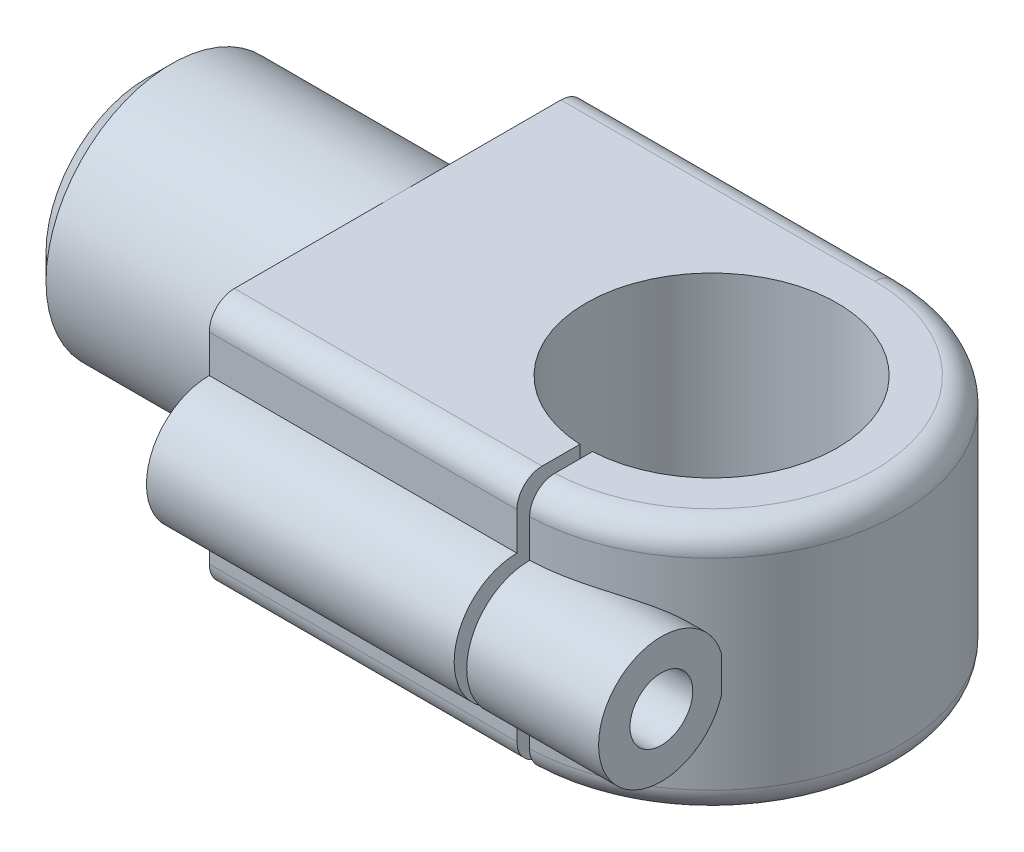
ISO-10303-21;
HEADER;
FILE_DESCRIPTION(('STEP AP214'),'2;1');
FILE_NAME('part.step','',(''),(''),'','','');
FILE_SCHEMA(('AUTOMOTIVE_DESIGN { 1 0 10303 214 1 1 1 1 }'));
ENDSEC;
DATA;
#1=APPLICATION_CONTEXT('core data for automotive mechanical design processes');
#2=APPLICATION_PROTOCOL_DEFINITION('international standard','automotive_design',2000,#1);
#3=PRODUCT_CONTEXT('',#1,'mechanical');
#4=PRODUCT('Part','Part','',(#3));
#5=PRODUCT_RELATED_PRODUCT_CATEGORY('part','',(#4));
#6=PRODUCT_DEFINITION_FORMATION('','',#4);
#7=PRODUCT_DEFINITION_CONTEXT('part definition',#1,'design');
#8=PRODUCT_DEFINITION('design','',#6,#7);
#9=PRODUCT_DEFINITION_SHAPE('','',#8);
#10=(LENGTH_UNIT() NAMED_UNIT(*) SI_UNIT(.MILLI.,.METRE.));
#11=(NAMED_UNIT(*) PLANE_ANGLE_UNIT() SI_UNIT($,.RADIAN.));
#12=(NAMED_UNIT(*) SI_UNIT($,.STERADIAN.) SOLID_ANGLE_UNIT());
#13=UNCERTAINTY_MEASURE_WITH_UNIT(LENGTH_MEASURE(1.E-05),#10,'distance_accuracy_value','');
#14=(GEOMETRIC_REPRESENTATION_CONTEXT(3) GLOBAL_UNCERTAINTY_ASSIGNED_CONTEXT((#13)) GLOBAL_UNIT_ASSIGNED_CONTEXT((#10,
#11,#12)) REPRESENTATION_CONTEXT('',''));
#15=CARTESIAN_POINT('',(0.,0.,0.));
#16=DIRECTION('',(0.,0.,1.));
#17=DIRECTION('',(1.,0.,0.));
#18=AXIS2_PLACEMENT_3D('',#15,#16,#17);
#19=CARTESIAN_POINT('',(-44.9999999999995,10.,-4.71844785465692E-13));
#20=DIRECTION('',(-1.,0.,0.));
#21=DIRECTION('',(0.,0.,1.));
#22=AXIS2_PLACEMENT_3D('',#19,#20,#21);
#23=PLANE('',#22);
#24=CARTESIAN_POINT('',(-44.9999999999996,10.,-4.71844785465692E-13));
#25=DIRECTION('',(1.,0.,0.));
#26=DIRECTION('',(0.,0.,-1.));
#27=AXIS2_PLACEMENT_3D('',#24,#25,#26);
#28=CIRCLE('',#27,8.00000000000017);
#29=CARTESIAN_POINT('',(-44.9999999999996,10.,-8.00000000000064));
#30=VERTEX_POINT('',#29);
#31=EDGE_CURVE('E20',#30,#30,#28,.T.);
#32=ORIENTED_EDGE('',*,*,#31,.F.);
#33=EDGE_LOOP('',(#32));
#34=FACE_BOUND('',#33,.T.);
#35=ADVANCED_FACE('F17',(#34),#23,.T.);
#36=CARTESIAN_POINT('',(-20.,10.,15.));
#37=DIRECTION('',(1.,0.,0.));
#38=DIRECTION('',(0.,0.,-1.));
#39=AXIS2_PLACEMENT_3D('',#36,#37,#38);
#40=PLANE('',#39);
#41=CARTESIAN_POINT('',(-20.,10.,15.));
#42=DIRECTION('',(1.,0.,0.));
#43=DIRECTION('',(0.,0.,-1.));
#44=AXIS2_PLACEMENT_3D('',#41,#42,#43);
#45=CIRCLE('',#44,2.5000000000001);
#46=CARTESIAN_POINT('',(-20.,10.,12.4999999999999));
#47=VERTEX_POINT('',#46);
#48=EDGE_CURVE('E174',#47,#47,#45,.T.);
#49=ORIENTED_EDGE('',*,*,#48,.T.);
#50=EDGE_LOOP('',(#49));
#51=FACE_BOUND('',#50,.T.);
#52=ADVANCED_FACE('F414',(#51),#40,.T.);
#53=CARTESIAN_POINT('',(-42.9999999999997,10.,-4.71844785465692E-13));
#54=DIRECTION('',(1.,0.,0.));
#55=DIRECTION('',(0.,0.,-1.));
#56=AXIS2_PLACEMENT_3D('',#53,#54,#55);
#57=CONICAL_SURFACE('',#56,10.0000000000001,0.785398163397446);
#58=CARTESIAN_POINT('',(-43.,10.,-4.71844785465692E-13));
#59=DIRECTION('',(1.,0.,0.));
#60=DIRECTION('',(0.,0.,-1.));
#61=AXIS2_PLACEMENT_3D('',#58,#59,#60);
#62=CIRCLE('',#61,10.0000000000004);
#63=CARTESIAN_POINT('',(-43.,10.,-10.0000000000009));
#64=VERTEX_POINT('',#63);
#65=EDGE_CURVE('E170',#64,#64,#62,.T.);
#66=ORIENTED_EDGE('',*,*,#65,.F.);
#67=EDGE_LOOP('',(#66));
#68=FACE_BOUND('',#67,.T.);
#69=ORIENTED_EDGE('',*,*,#31,.T.);
#70=EDGE_LOOP('',(#69));
#71=FACE_BOUND('',#70,.T.);
#72=ADVANCED_FACE('F411',(#68,#71),#57,.T.);
#73=CARTESIAN_POINT('',(-20.,10.,15.));
#74=DIRECTION('',(1.,0.,0.));
#75=DIRECTION('',(0.,0.,-1.));
#76=AXIS2_PLACEMENT_3D('',#73,#74,#75);
#77=CYLINDRICAL_SURFACE('',#76,2.5000000000001);
#78=CARTESIAN_POINT('',(-0.5,10.,15.));
#79=DIRECTION('',(1.,0.,0.));
#80=DIRECTION('',(0.,0.,-1.));
#81=AXIS2_PLACEMENT_3D('',#78,#79,#80);
#82=CIRCLE('',#81,2.5000000000001);
#83=CARTESIAN_POINT('',(-0.5,10.,12.4999999999999));
#84=VERTEX_POINT('',#83);
#85=EDGE_CURVE('E166',#84,#84,#82,.T.);
#86=ORIENTED_EDGE('',*,*,#85,.T.);
#87=EDGE_LOOP('',(#86));
#88=FACE_BOUND('',#87,.T.);
#89=ORIENTED_EDGE('',*,*,#48,.F.);
#90=EDGE_LOOP('',(#89));
#91=FACE_BOUND('',#90,.T.);
#92=ADVANCED_FACE('F421',(#88,#91),#77,.F.);
#93=CARTESIAN_POINT('',(0.,20.,14.9999999999973));
#94=DIRECTION('',(0.,0.,-1.));
#95=DIRECTION('',(-1.,0.,0.));
#96=AXIS2_PLACEMENT_3D('',#93,#94,#95);
#97=PLANE('',#96);
#98=DIRECTION('',(1.,0.,0.));
#99=VECTOR('',#98,1.);
#100=CARTESIAN_POINT('',(0.,2.,15.0000000000001));
#101=LINE('',#100,#99);
#102=CARTESIAN_POINT('',(-0.500000000000001,2.,15.0000000000001));
#103=VERTEX_POINT('',#102);
#104=CARTESIAN_POINT('',(-25.,2.,15.));
#105=VERTEX_POINT('',#104);
#106=EDGE_CURVE('E151',#103,#105,#101,.F.);
#107=ORIENTED_EDGE('',*,*,#106,.F.);
#108=DIRECTION('',(0.,1.,0.));
#109=VECTOR('',#108,1.);
#110=CARTESIAN_POINT('',(-0.5,20.,15.));
#111=LINE('',#110,#109);
#112=CARTESIAN_POINT('',(-0.5,4.99999999999981,15.));
#113=VERTEX_POINT('',#112);
#114=EDGE_CURVE('E387',#103,#113,#111,.T.);
#115=ORIENTED_EDGE('',*,*,#114,.T.);
#116=DIRECTION('',(-1.,0.,0.));
#117=VECTOR('',#116,1.);
#118=CARTESIAN_POINT('',(11.,4.99999999999981,15.));
#119=LINE('',#118,#117);
#120=CARTESIAN_POINT('',(-25.,4.99999999999981,15.));
#121=VERTEX_POINT('',#120);
#122=EDGE_CURVE('E171',#121,#113,#119,.F.);
#123=ORIENTED_EDGE('',*,*,#122,.F.);
#124=DIRECTION('',(0.,1.,0.));
#125=VECTOR('',#124,1.);
#126=CARTESIAN_POINT('',(-25.,0.,15.));
#127=LINE('',#126,#125);
#128=EDGE_CURVE('E398',#105,#121,#127,.T.);
#129=ORIENTED_EDGE('',*,*,#128,.F.);
#130=EDGE_LOOP('',(#107,#115,#123,#129));
#131=FACE_BOUND('',#130,.T.);
#132=ADVANCED_FACE('F427',(#131),#97,.F.);
#133=CARTESIAN_POINT('',(11.,10.,14.9999999999999));
#134=DIRECTION('',(-1.,0.,0.));
#135=DIRECTION('',(0.,0.,1.));
#136=AXIS2_PLACEMENT_3D('',#133,#134,#135);
#137=CYLINDRICAL_SURFACE('',#136,5.0000000000002);
#138=DIRECTION('',(-1.,0.,0.));
#139=VECTOR('',#138,1.);
#140=CARTESIAN_POINT('',(0.,15.,14.9999999999973));
#141=LINE('',#140,#139);
#142=CARTESIAN_POINT('',(-0.5,15.0000000000001,14.9999999999987));
#143=VERTEX_POINT('',#142);
#144=CARTESIAN_POINT('',(-25.,15.0000000000001,14.9999999999987));
#145=VERTEX_POINT('',#144);
#146=EDGE_CURVE('E168',#143,#145,#141,.T.);
#147=ORIENTED_EDGE('',*,*,#146,.T.);
#148=CARTESIAN_POINT('',(-25.,10.,14.9999999999999));
#149=DIRECTION('',(-1.,0.,0.));
#150=DIRECTION('',(0.,0.,1.));
#151=AXIS2_PLACEMENT_3D('',#148,#149,#150);
#152=CIRCLE('',#151,5.0000000000002);
#153=EDGE_CURVE('E397',#121,#145,#152,.T.);
#154=ORIENTED_EDGE('',*,*,#153,.F.);
#155=ORIENTED_EDGE('',*,*,#122,.T.);
#156=CARTESIAN_POINT('',(-0.5,10.,14.9999999999999));
#157=DIRECTION('',(-1.,0.,0.));
#158=DIRECTION('',(0.,0.,1.));
#159=AXIS2_PLACEMENT_3D('',#156,#157,#158);
#160=CIRCLE('',#159,5.0000000000002);
#161=EDGE_CURVE('E386',#113,#143,#160,.T.);
#162=ORIENTED_EDGE('',*,*,#161,.T.);
#163=EDGE_LOOP('',(#147,#154,#155,#162));
#164=FACE_BOUND('',#163,.T.);
#165=ADVANCED_FACE('F431',(#164),#137,.T.);
#166=CARTESIAN_POINT('',(0.,20.,14.9999999999973));
#167=DIRECTION('',(0.,0.,-1.));
#168=DIRECTION('',(-1.,0.,0.));
#169=AXIS2_PLACEMENT_3D('',#166,#167,#168);
#170=PLANE('',#169);
#171=ORIENTED_EDGE('',*,*,#146,.F.);
#172=DIRECTION('',(0.,1.,0.));
#173=VECTOR('',#172,1.);
#174=CARTESIAN_POINT('',(-0.5,20.,15.));
#175=LINE('',#174,#173);
#176=CARTESIAN_POINT('',(-0.5,18.,15.0000000000001));
#177=VERTEX_POINT('',#176);
#178=EDGE_CURVE('E384',#143,#177,#175,.T.);
#179=ORIENTED_EDGE('',*,*,#178,.T.);
#180=DIRECTION('',(-1.,0.,0.));
#181=VECTOR('',#180,1.);
#182=CARTESIAN_POINT('',(0.,18.,15.0000000000001));
#183=LINE('',#182,#181);
#184=CARTESIAN_POINT('',(-24.9999999999999,18.,15.));
#185=VERTEX_POINT('',#184);
#186=EDGE_CURVE('E163',#185,#177,#183,.F.);
#187=ORIENTED_EDGE('',*,*,#186,.F.);
#188=DIRECTION('',(0.,1.,0.));
#189=VECTOR('',#188,1.);
#190=CARTESIAN_POINT('',(-25.,0.,15.));
#191=LINE('',#190,#189);
#192=EDGE_CURVE('E396',#145,#185,#191,.T.);
#193=ORIENTED_EDGE('',*,*,#192,.F.);
#194=EDGE_LOOP('',(#171,#179,#187,#193));
#195=FACE_BOUND('',#194,.T.);
#196=ADVANCED_FACE('F435',(#195),#170,.F.);
#197=CARTESIAN_POINT('',(-44.9999999999995,10.,-4.71844785465692E-13));
#198=DIRECTION('',(1.,0.,0.));
#199=DIRECTION('',(0.,0.,-1.));
#200=AXIS2_PLACEMENT_3D('',#197,#198,#199);
#201=CYLINDRICAL_SURFACE('',#200,10.0000000000004);
#202=CARTESIAN_POINT('',(-25.,10.,-4.71844785465692E-13));
#203=DIRECTION('',(1.,0.,0.));
#204=DIRECTION('',(0.,0.,-1.));
#205=AXIS2_PLACEMENT_3D('',#202,#203,#204);
#206=CIRCLE('',#205,10.0000000000004);
#207=CARTESIAN_POINT('',(-25.,20.0000000000002,-2.35673442920311E-13));
#208=VERTEX_POINT('',#207);
#209=CARTESIAN_POINT('',(-25.,-1.95156391047391E-13,-2.35559019145788E-13));
#210=VERTEX_POINT('',#209);
#211=EDGE_CURVE('E125',#208,#210,#206,.T.);
#212=ORIENTED_EDGE('',*,*,#211,.F.);
#213=CARTESIAN_POINT('',(-25.,10.,-4.71844785465692E-13));
#214=DIRECTION('',(1.,0.,0.));
#215=DIRECTION('',(0.,0.,-1.));
#216=AXIS2_PLACEMENT_3D('',#213,#214,#215);
#217=CIRCLE('',#216,10.0000000000004);
#218=EDGE_CURVE('E120',#210,#208,#217,.T.);
#219=ORIENTED_EDGE('',*,*,#218,.F.);
#220=EDGE_LOOP('',(#212,#219));
#221=FACE_BOUND('',#220,.T.);
#222=ORIENTED_EDGE('',*,*,#65,.T.);
#223=EDGE_LOOP('',(#222));
#224=FACE_BOUND('',#223,.T.);
#225=ADVANCED_FACE('F122',(#221,#224),#201,.T.);
#226=CARTESIAN_POINT('',(0.,2.,13.));
#227=DIRECTION('',(1.,0.,0.));
#228=DIRECTION('',(0.,0.,-1.));
#229=AXIS2_PLACEMENT_3D('',#226,#227,#228);
#230=CYLINDRICAL_SURFACE('',#229,2.00000000000008);
#231=DIRECTION('',(1.,0.,0.));
#232=VECTOR('',#231,1.);
#233=CARTESIAN_POINT('',(0.,0.,12.9999999999994));
#234=LINE('',#233,#232);
#235=CARTESIAN_POINT('',(-25.,0.,12.9999999999997));
#236=VERTEX_POINT('',#235);
#237=CARTESIAN_POINT('',(-0.5,0.,12.9999999999997));
#238=VERTEX_POINT('',#237);
#239=EDGE_CURVE('E155',#236,#238,#234,.T.);
#240=ORIENTED_EDGE('',*,*,#239,.T.);
#241=CARTESIAN_POINT('',(-0.5,2.,13.));
#242=DIRECTION('',(1.,0.,0.));
#243=DIRECTION('',(0.,0.,-1.));
#244=AXIS2_PLACEMENT_3D('',#241,#242,#243);
#245=CIRCLE('',#244,2.00000000000008);
#246=EDGE_CURVE('E390',#238,#103,#245,.F.);
#247=ORIENTED_EDGE('',*,*,#246,.T.);
#248=ORIENTED_EDGE('',*,*,#106,.T.);
#249=CARTESIAN_POINT('',(-25.,2.,13.));
#250=DIRECTION('',(1.,0.,0.));
#251=DIRECTION('',(0.,0.,-1.));
#252=AXIS2_PLACEMENT_3D('',#249,#250,#251);
#253=CIRCLE('',#252,2.00000000000008);
#254=EDGE_CURVE('E150',#236,#105,#253,.F.);
#255=ORIENTED_EDGE('',*,*,#254,.F.);
#256=EDGE_LOOP('',(#240,#247,#248,#255));
#257=FACE_BOUND('',#256,.T.);
#258=ADVANCED_FACE('F442',(#257),#230,.T.);
#259=CARTESIAN_POINT('',(-25.,0.,0.));
#260=DIRECTION('',(-1.,0.,0.));
#261=DIRECTION('',(0.,0.,1.));
#262=AXIS2_PLACEMENT_3D('',#259,#260,#261);
#263=PLANE('',#262);
#264=ORIENTED_EDGE('',*,*,#192,.T.);
#265=CARTESIAN_POINT('',(-24.9999999999998,18.,13.));
#266=DIRECTION('',(-1.,0.,0.));
#267=DIRECTION('',(0.,0.,1.));
#268=AXIS2_PLACEMENT_3D('',#265,#266,#267);
#269=CIRCLE('',#268,2.00000000000008);
#270=CARTESIAN_POINT('',(-24.9999999999999,20.,12.9999999999997));
#271=VERTEX_POINT('',#270);
#272=EDGE_CURVE('E167',#271,#185,#269,.F.);
#273=ORIENTED_EDGE('',*,*,#272,.F.);
#274=DIRECTION('',(0.,0.,1.));
#275=VECTOR('',#274,1.);
#276=CARTESIAN_POINT('',(-25.,20.,0.));
#277=LINE('',#276,#275);
#278=EDGE_CURVE('E148',#208,#271,#277,.T.);
#279=ORIENTED_EDGE('',*,*,#278,.F.);
#280=ORIENTED_EDGE('',*,*,#211,.T.);
#281=DIRECTION('',(0.,0.,1.));
#282=VECTOR('',#281,1.);
#283=CARTESIAN_POINT('',(-25.,0.,0.));
#284=LINE('',#283,#282);
#285=EDGE_CURVE('E139',#210,#236,#284,.T.);
#286=ORIENTED_EDGE('',*,*,#285,.T.);
#287=ORIENTED_EDGE('',*,*,#254,.T.);
#288=ORIENTED_EDGE('',*,*,#128,.T.);
#289=ORIENTED_EDGE('',*,*,#153,.T.);
#290=EDGE_LOOP('',(#264,#273,#279,#280,#286,#287,#288,#289));
#291=FACE_BOUND('',#290,.T.);
#292=ADVANCED_FACE('F144',(#291),#263,.T.);
#293=CARTESIAN_POINT('',(0.,18.,13.));
#294=DIRECTION('',(-1.,0.,0.));
#295=DIRECTION('',(0.,0.,1.));
#296=AXIS2_PLACEMENT_3D('',#293,#294,#295);
#297=CYLINDRICAL_SURFACE('',#296,2.00000000000008);
#298=ORIENTED_EDGE('',*,*,#186,.T.);
#299=CARTESIAN_POINT('',(-0.5,18.,13.));
#300=DIRECTION('',(-1.,0.,0.));
#301=DIRECTION('',(0.,0.,1.));
#302=AXIS2_PLACEMENT_3D('',#299,#300,#301);
#303=CIRCLE('',#302,2.00000000000008);
#304=CARTESIAN_POINT('',(-0.5,20.,12.9999999999997));
#305=VERTEX_POINT('',#304);
#306=EDGE_CURVE('E383',#177,#305,#303,.T.);
#307=ORIENTED_EDGE('',*,*,#306,.T.);
#308=DIRECTION('',(1.,0.,0.));
#309=VECTOR('',#308,1.);
#310=CARTESIAN_POINT('',(0.,20.,12.9999999999994));
#311=LINE('',#310,#309);
#312=EDGE_CURVE('E391',#271,#305,#311,.T.);
#313=ORIENTED_EDGE('',*,*,#312,.F.);
#314=ORIENTED_EDGE('',*,*,#272,.T.);
#315=EDGE_LOOP('',(#298,#307,#313,#314));
#316=FACE_BOUND('',#315,.T.);
#317=ADVANCED_FACE('F448',(#316),#297,.T.);
#318=CARTESIAN_POINT('',(-0.5,20.,-3.05311331771918E-12));
#319=DIRECTION('',(-1.,0.,0.));
#320=DIRECTION('',(0.,0.,1.));
#321=AXIS2_PLACEMENT_3D('',#318,#319,#320);
#322=PLANE('',#321);
#323=ORIENTED_EDGE('',*,*,#306,.F.);
#324=ORIENTED_EDGE('',*,*,#178,.F.);
#325=ORIENTED_EDGE('',*,*,#161,.F.);
#326=ORIENTED_EDGE('',*,*,#114,.F.);
#327=ORIENTED_EDGE('',*,*,#246,.F.);
#328=DIRECTION('',(0.,0.,1.));
#329=VECTOR('',#328,1.);
#330=CARTESIAN_POINT('',(-0.5,0.,0.));
#331=LINE('',#330,#329);
#332=CARTESIAN_POINT('',(-0.500000000000009,0.,9.98749217771948));
#333=VERTEX_POINT('',#332);
#334=EDGE_CURVE('E162',#238,#333,#331,.F.);
#335=ORIENTED_EDGE('',*,*,#334,.T.);
#336=DIRECTION('',(0.,-1.,0.));
#337=VECTOR('',#336,1.);
#338=CARTESIAN_POINT('',(-0.500000000000017,20.,9.98749217771948));
#339=LINE('',#338,#337);
#340=CARTESIAN_POINT('',(-0.500000000000009,20.,9.98749217771948));
#341=VERTEX_POINT('',#340);
#342=EDGE_CURVE('E380',#333,#341,#339,.F.);
#343=ORIENTED_EDGE('',*,*,#342,.T.);
#344=DIRECTION('',(0.,0.,1.));
#345=VECTOR('',#344,1.);
#346=CARTESIAN_POINT('',(-0.5,20.,0.));
#347=LINE('',#346,#345);
#348=EDGE_CURVE('E394',#305,#341,#347,.F.);
#349=ORIENTED_EDGE('',*,*,#348,.F.);
#350=EDGE_LOOP('',(#323,#324,#325,#326,#327,#335,#343,#349));
#351=FACE_BOUND('',#350,.T.);
#352=ORIENTED_EDGE('',*,*,#85,.F.);
#353=EDGE_LOOP('',(#352));
#354=FACE_BOUND('',#353,.T.);
#355=ADVANCED_FACE('F451',(#351,#354),#322,.F.);
#356=CARTESIAN_POINT('',(0.,2.,-13.));
#357=DIRECTION('',(-1.,0.,0.));
#358=DIRECTION('',(0.,0.,1.));
#359=AXIS2_PLACEMENT_3D('',#356,#357,#358);
#360=CYLINDRICAL_SURFACE('',#359,2.00000000000008);
#361=DIRECTION('',(1.,0.,0.));
#362=VECTOR('',#361,1.);
#363=CARTESIAN_POINT('',(0.,2.,-15.));
#364=LINE('',#363,#362);
#365=CARTESIAN_POINT('',(-25.,2.,-15.));
#366=VERTEX_POINT('',#365);
#367=CARTESIAN_POINT('',(0.,2.,-15.0000000000003));
#368=VERTEX_POINT('',#367);
#369=EDGE_CURVE('E289',#366,#368,#364,.T.);
#370=ORIENTED_EDGE('',*,*,#369,.T.);
#371=CARTESIAN_POINT('',(0.,2.,-13.));
#372=DIRECTION('',(-1.,0.,0.));
#373=DIRECTION('',(0.,0.,-1.));
#374=AXIS2_PLACEMENT_3D('',#371,#372,#373);
#375=CIRCLE('',#374,2.);
#376=CARTESIAN_POINT('',(0.,0.,-13.));
#377=VERTEX_POINT('',#376);
#378=EDGE_CURVE('E286',#377,#368,#375,.F.);
#379=ORIENTED_EDGE('',*,*,#378,.F.);
#380=DIRECTION('',(1.,0.,0.));
#381=VECTOR('',#380,1.);
#382=CARTESIAN_POINT('',(0.,0.,-13.));
#383=LINE('',#382,#381);
#384=CARTESIAN_POINT('',(-24.9999999999998,0.,-13.));
#385=VERTEX_POINT('',#384);
#386=EDGE_CURVE('E140',#377,#385,#383,.F.);
#387=ORIENTED_EDGE('',*,*,#386,.T.);
#388=CARTESIAN_POINT('',(-24.9999999999998,2.,-13.));
#389=DIRECTION('',(-1.,0.,0.));
#390=DIRECTION('',(0.,0.,1.));
#391=AXIS2_PLACEMENT_3D('',#388,#389,#390);
#392=CIRCLE('',#391,2.00000000000008);
#393=EDGE_CURVE('E129',#366,#385,#392,.T.);
#394=ORIENTED_EDGE('',*,*,#393,.F.);
#395=EDGE_LOOP('',(#370,#379,#387,#394));
#396=FACE_BOUND('',#395,.T.);
#397=ADVANCED_FACE('F367',(#396),#360,.T.);
#398=CARTESIAN_POINT('',(-25.,0.,0.));
#399=DIRECTION('',(-1.,0.,0.));
#400=DIRECTION('',(0.,0.,1.));
#401=AXIS2_PLACEMENT_3D('',#398,#399,#400);
#402=PLANE('',#401);
#403=DIRECTION('',(0.,0.,1.));
#404=VECTOR('',#403,1.);
#405=CARTESIAN_POINT('',(-24.9999999999998,20.,0.));
#406=LINE('',#405,#404);
#407=CARTESIAN_POINT('',(-25.,20.,-13.));
#408=VERTEX_POINT('',#407);
#409=EDGE_CURVE('E156',#408,#208,#406,.T.);
#410=ORIENTED_EDGE('',*,*,#409,.F.);
#411=CARTESIAN_POINT('',(-25.0000000000002,18.,-13.));
#412=DIRECTION('',(1.,0.,0.));
#413=DIRECTION('',(0.,0.,-1.));
#414=AXIS2_PLACEMENT_3D('',#411,#412,#413);
#415=CIRCLE('',#414,2.00000000000008);
#416=CARTESIAN_POINT('',(-25.0000000000002,18.,-15.));
#417=VERTEX_POINT('',#416);
#418=EDGE_CURVE('E128',#417,#408,#415,.T.);
#419=ORIENTED_EDGE('',*,*,#418,.F.);
#420=DIRECTION('',(0.,1.,0.));
#421=VECTOR('',#420,1.);
#422=CARTESIAN_POINT('',(-25.0000000000002,20.,-15.));
#423=LINE('',#422,#421);
#424=EDGE_CURVE('E371',#417,#366,#423,.F.);
#425=ORIENTED_EDGE('',*,*,#424,.T.);
#426=ORIENTED_EDGE('',*,*,#393,.T.);
#427=DIRECTION('',(0.,0.,1.));
#428=VECTOR('',#427,1.);
#429=CARTESIAN_POINT('',(-24.9999999999998,0.,0.));
#430=LINE('',#429,#428);
#431=EDGE_CURVE('E133',#385,#210,#430,.T.);
#432=ORIENTED_EDGE('',*,*,#431,.T.);
#433=ORIENTED_EDGE('',*,*,#218,.T.);
#434=EDGE_LOOP('',(#410,#419,#425,#426,#432,#433));
#435=FACE_BOUND('',#434,.T.);
#436=ADVANCED_FACE('F134',(#435),#402,.T.);
#437=CARTESIAN_POINT('',(0.,18.,-13.));
#438=DIRECTION('',(1.,0.,0.));
#439=DIRECTION('',(0.,0.,-1.));
#440=AXIS2_PLACEMENT_3D('',#437,#438,#439);
#441=CYLINDRICAL_SURFACE('',#440,2.00000000000008);
#442=DIRECTION('',(1.,0.,0.));
#443=VECTOR('',#442,1.);
#444=CARTESIAN_POINT('',(0.,20.,-13.));
#445=LINE('',#444,#443);
#446=CARTESIAN_POINT('',(0.,20.,-13.));
#447=VERTEX_POINT('',#446);
#448=EDGE_CURVE('E305',#447,#408,#445,.F.);
#449=ORIENTED_EDGE('',*,*,#448,.F.);
#450=CARTESIAN_POINT('',(0.,18.,-13.));
#451=DIRECTION('',(-1.,0.,0.));
#452=DIRECTION('',(0.,0.,-1.));
#453=AXIS2_PLACEMENT_3D('',#450,#451,#452);
#454=CIRCLE('',#453,2.);
#455=CARTESIAN_POINT('',(0.,18.,-15.0000000000003));
#456=VERTEX_POINT('',#455);
#457=EDGE_CURVE('E237',#456,#447,#454,.F.);
#458=ORIENTED_EDGE('',*,*,#457,.F.);
#459=DIRECTION('',(1.,0.,0.));
#460=VECTOR('',#459,1.);
#461=CARTESIAN_POINT('',(0.,18.,-15.));
#462=LINE('',#461,#460);
#463=EDGE_CURVE('E479',#456,#417,#462,.F.);
#464=ORIENTED_EDGE('',*,*,#463,.T.);
#465=ORIENTED_EDGE('',*,*,#418,.T.);
#466=EDGE_LOOP('',(#449,#458,#464,#465));
#467=FACE_BOUND('',#466,.T.);
#468=ADVANCED_FACE('F320',(#467),#441,.T.);
#469=CARTESIAN_POINT('',(0.,0.,0.));
#470=DIRECTION('',(0.,1.,0.));
#471=DIRECTION('',(0.,0.,1.));
#472=AXIS2_PLACEMENT_3D('',#469,#470,#471);
#473=PLANE('',#472);
#474=ORIENTED_EDGE('',*,*,#431,.F.);
#475=ORIENTED_EDGE('',*,*,#386,.F.);
#476=CARTESIAN_POINT('',(0.,0.,0.));
#477=DIRECTION('',(0.,1.,0.));
#478=DIRECTION('',(0.0384615384615385,0.,0.999260081289737));
#479=AXIS2_PLACEMENT_3D('',#476,#477,#478);
#480=CIRCLE('',#479,13.);
#481=CARTESIAN_POINT('',(0.5,0.,12.9903810567666));
#482=VERTEX_POINT('',#481);
#483=EDGE_CURVE('E290',#482,#377,#480,.T.);
#484=ORIENTED_EDGE('',*,*,#483,.F.);
#485=DIRECTION('',(0.,0.,1.));
#486=VECTOR('',#485,1.);
#487=CARTESIAN_POINT('',(0.5,0.,-1.88737914186277E-12));
#488=LINE('',#487,#486);
#489=CARTESIAN_POINT('',(0.5,0.,9.98749217771923));
#490=VERTEX_POINT('',#489);
#491=EDGE_CURVE('E223',#490,#482,#488,.T.);
#492=ORIENTED_EDGE('',*,*,#491,.F.);
#493=CARTESIAN_POINT('',(0.,0.,0.));
#494=DIRECTION('',(0.,-1.,0.));
#495=DIRECTION('',(0.,0.,-1.));
#496=AXIS2_PLACEMENT_3D('',#493,#494,#495);
#497=CIRCLE('',#496,10.0000000000004);
#498=EDGE_CURVE('E464',#490,#333,#497,.F.);
#499=ORIENTED_EDGE('',*,*,#498,.T.);
#500=ORIENTED_EDGE('',*,*,#334,.F.);
#501=ORIENTED_EDGE('',*,*,#239,.F.);
#502=ORIENTED_EDGE('',*,*,#285,.F.);
#503=EDGE_LOOP('',(#474,#475,#484,#492,#499,#500,#501,#502));
#504=FACE_BOUND('',#503,.T.);
#505=ADVANCED_FACE('F153',(#504),#473,.F.);
#506=CARTESIAN_POINT('',(0.,20.,0.));
#507=DIRECTION('',(0.,1.,0.));
#508=DIRECTION('',(0.,0.,1.));
#509=AXIS2_PLACEMENT_3D('',#506,#507,#508);
#510=PLANE('',#509);
#511=CARTESIAN_POINT('',(0.,20.,0.));
#512=DIRECTION('',(0.,-1.,0.));
#513=DIRECTION('',(0.,0.,-1.));
#514=AXIS2_PLACEMENT_3D('',#511,#512,#513);
#515=CIRCLE('',#514,13.);
#516=CARTESIAN_POINT('',(0.5,20.,12.9903810567666));
#517=VERTEX_POINT('',#516);
#518=EDGE_CURVE('E299',#447,#517,#515,.T.);
#519=ORIENTED_EDGE('',*,*,#518,.F.);
#520=ORIENTED_EDGE('',*,*,#448,.T.);
#521=ORIENTED_EDGE('',*,*,#409,.T.);
#522=ORIENTED_EDGE('',*,*,#278,.T.);
#523=ORIENTED_EDGE('',*,*,#312,.T.);
#524=ORIENTED_EDGE('',*,*,#348,.T.);
#525=CARTESIAN_POINT('',(0.,20.,0.));
#526=DIRECTION('',(0.,-1.,0.));
#527=DIRECTION('',(0.,0.,-1.));
#528=AXIS2_PLACEMENT_3D('',#525,#526,#527);
#529=CIRCLE('',#528,10.0000000000004);
#530=CARTESIAN_POINT('',(0.5,20.,9.98749217771923));
#531=VERTEX_POINT('',#530);
#532=EDGE_CURVE('E344',#341,#531,#529,.T.);
#533=ORIENTED_EDGE('',*,*,#532,.T.);
#534=DIRECTION('',(0.,0.,1.));
#535=VECTOR('',#534,1.);
#536=CARTESIAN_POINT('',(0.5,20.,-1.88737914186277E-12));
#537=LINE('',#536,#535);
#538=EDGE_CURVE('E216',#517,#531,#537,.F.);
#539=ORIENTED_EDGE('',*,*,#538,.F.);
#540=EDGE_LOOP('',(#519,#520,#521,#522,#523,#524,#533,#539));
#541=FACE_BOUND('',#540,.T.);
#542=ADVANCED_FACE('F307',(#541),#510,.T.);
#543=CARTESIAN_POINT('',(0.,20.,0.));
#544=DIRECTION('',(0.,-1.,0.));
#545=DIRECTION('',(0.,0.,-1.));
#546=AXIS2_PLACEMENT_3D('',#543,#544,#545);
#547=CYLINDRICAL_SURFACE('',#546,10.0000000000004);
#548=ORIENTED_EDGE('',*,*,#532,.F.);
#549=ORIENTED_EDGE('',*,*,#342,.F.);
#550=ORIENTED_EDGE('',*,*,#498,.F.);
#551=DIRECTION('',(0.,1.,0.));
#552=VECTOR('',#551,1.);
#553=CARTESIAN_POINT('',(0.5,20.,9.98749217771896));
#554=LINE('',#553,#552);
#555=EDGE_CURVE('E219',#531,#490,#554,.F.);
#556=ORIENTED_EDGE('',*,*,#555,.F.);
#557=EDGE_LOOP('',(#548,#549,#550,#556));
#558=FACE_BOUND('',#557,.T.);
#559=ADVANCED_FACE('F316',(#558),#547,.F.);
#560=CARTESIAN_POINT('',(-20.,10.,15.));
#561=DIRECTION('',(1.,0.,0.));
#562=DIRECTION('',(0.,0.,-1.));
#563=AXIS2_PLACEMENT_3D('',#560,#561,#562);
#564=CYLINDRICAL_SURFACE('',#563,2.5000000000001);
#565=CARTESIAN_POINT('',(0.5,10.,15.));
#566=DIRECTION('',(1.,0.,0.));
#567=DIRECTION('',(0.,0.,-1.));
#568=AXIS2_PLACEMENT_3D('',#565,#566,#567);
#569=CIRCLE('',#568,2.5000000000001);
#570=CARTESIAN_POINT('',(0.5,10.,12.4999999999999));
#571=VERTEX_POINT('',#570);
#572=EDGE_CURVE('E227',#571,#571,#569,.T.);
#573=ORIENTED_EDGE('',*,*,#572,.F.);
#574=EDGE_LOOP('',(#573));
#575=FACE_BOUND('',#574,.T.);
#576=CARTESIAN_POINT('',(11.,10.,15.));
#577=DIRECTION('',(1.,0.,0.));
#578=DIRECTION('',(0.,0.,-1.));
#579=AXIS2_PLACEMENT_3D('',#576,#577,#578);
#580=CIRCLE('',#579,2.5000000000001);
#581=CARTESIAN_POINT('',(11.,10.,12.4999999999999));
#582=VERTEX_POINT('',#581);
#583=EDGE_CURVE('E469',#582,#582,#580,.T.);
#584=ORIENTED_EDGE('',*,*,#583,.T.);
#585=EDGE_LOOP('',(#584));
#586=FACE_BOUND('',#585,.T.);
#587=ADVANCED_FACE('F276',(#575,#586),#564,.F.);
#588=CARTESIAN_POINT('',(0.,2.,0.));
#589=DIRECTION('',(0.,1.,0.));
#590=DIRECTION('',(0.,0.,1.));
#591=AXIS2_PLACEMENT_3D('',#588,#589,#590);
#592=TOROIDAL_SURFACE('',#591,13.,2.);
#593=ORIENTED_EDGE('',*,*,#378,.T.);
#594=CARTESIAN_POINT('',(0.,2.,0.));
#595=DIRECTION('',(0.,-1.,0.));
#596=DIRECTION('',(0.,0.,-1.));
#597=AXIS2_PLACEMENT_3D('',#594,#595,#596);
#598=CIRCLE('',#597,15.0000000000006);
#599=CARTESIAN_POINT('',(0.500000000000009,2.,14.9916643505652));
#600=VERTEX_POINT('',#599);
#601=EDGE_CURVE('E214',#600,#368,#598,.F.);
#602=ORIENTED_EDGE('',*,*,#601,.F.);
#603=CARTESIAN_POINT('',(0.5,0.,12.9903810567666));
#604=CARTESIAN_POINT('',(0.5,3.94737133964102E-07,13.0467150517622));
#605=CARTESIAN_POINT('',(0.5,0.00237810906510782,13.1030220893135));
#606=CARTESIAN_POINT('',(0.5,0.0118641925217008,13.2152335880618));
#607=CARTESIAN_POINT('',(0.5,0.0189723456133892,13.2711380675255));
#608=CARTESIAN_POINT('',(0.5,0.0473260376236344,13.4375518105527));
#609=CARTESIAN_POINT('',(0.5,0.075600990791056,13.5469468798408));
#610=CARTESIAN_POINT('',(0.5,0.150116828675945,13.7594349112839));
#611=CARTESIAN_POINT('',(0.500000000000001,0.19636654020422,13.8625247483166));
#612=CARTESIAN_POINT('',(0.5,0.30551847309806,14.0594686839331));
#613=CARTESIAN_POINT('',(0.5,0.368417635688983,14.1533244746213));
#614=CARTESIAN_POINT('',(0.5,0.509059319417749,14.3290962106334));
#615=CARTESIAN_POINT('',(0.5,0.586795864960072,14.4110169393336));
#616=CARTESIAN_POINT('',(0.500000000000001,0.754945090450362,14.5606526495886));
#617=CARTESIAN_POINT('',(0.500000000000001,0.845360238262559,14.628364859063));
#618=CARTESIAN_POINT('',(0.500000000000001,1.03623337644501,14.7476054118712));
#619=CARTESIAN_POINT('',(0.500000000000001,1.13668715850132,14.7991404996362));
#620=CARTESIAN_POINT('',(0.5,1.34480384834312,14.8845781538318));
#621=CARTESIAN_POINT('',(0.5,1.45246243117107,14.9184911932831));
#622=CARTESIAN_POINT('',(0.500000000000001,1.63398865222376,14.9592514657033));
#623=CARTESIAN_POINT('',(0.500000000000001,1.7067102690232,14.9713989793658));
#624=CARTESIAN_POINT('',(0.5,1.8529443835521,14.9876043053115));
#625=CARTESIAN_POINT('',(0.499999999999997,1.92645560947976,14.9916735975547));
#626=CARTESIAN_POINT('',(0.499999999999991,1.99999999999997,14.9916643505649));
#627=B_SPLINE_CURVE_WITH_KNOTS('',3,(#603,#604,#605,#606,#607,#608,#609,#610,#611,#612,#613,
#614,#615,#616,#617,#618,#619,#620,#621,#622,#623,#624,#625,#626),.UNSPECIFIED.,.F.,.F.,(4,2,2,
2,2,2,2,2,2,2,2,4),(0.,0.168898256667987,0.337788800360702,0.675020464554627,1.01241794176533,
1.34975347654759,1.68695343866939,2.02421912742433,2.3613440188454,2.69826832258594,
2.91903837974999,3.13949447536185),.UNSPECIFIED.);
#628=EDGE_CURVE('E226',#482,#600,#627,.T.);
#629=ORIENTED_EDGE('',*,*,#628,.F.);
#630=ORIENTED_EDGE('',*,*,#483,.T.);
#631=EDGE_LOOP('',(#593,#602,#629,#630));
#632=FACE_BOUND('',#631,.T.);
#633=ADVANCED_FACE('F271',(#632),#592,.T.);
#634=CARTESIAN_POINT('',(0.,20.,-15.));
#635=DIRECTION('',(0.,0.,1.));
#636=DIRECTION('',(1.,0.,0.));
#637=AXIS2_PLACEMENT_3D('',#634,#635,#636);
#638=PLANE('',#637);
#639=ORIENTED_EDGE('',*,*,#463,.F.);
#640=DIRECTION('',(0.,-1.,0.));
#641=VECTOR('',#640,1.);
#642=CARTESIAN_POINT('',(0.,20.,-15.0000000000006));
#643=LINE('',#642,#641);
#644=EDGE_CURVE('E232',#368,#456,#643,.F.);
#645=ORIENTED_EDGE('',*,*,#644,.F.);
#646=ORIENTED_EDGE('',*,*,#369,.F.);
#647=ORIENTED_EDGE('',*,*,#424,.F.);
#648=EDGE_LOOP('',(#639,#645,#646,#647));
#649=FACE_BOUND('',#648,.T.);
#650=ADVANCED_FACE('F246',(#649),#638,.F.);
#651=CARTESIAN_POINT('',(0.,18.,0.));
#652=DIRECTION('',(0.,1.,0.));
#653=DIRECTION('',(0.,0.,1.));
#654=AXIS2_PLACEMENT_3D('',#651,#652,#653);
#655=TOROIDAL_SURFACE('',#654,13.,2.);
#656=ORIENTED_EDGE('',*,*,#457,.T.);
#657=ORIENTED_EDGE('',*,*,#518,.T.);
#658=CARTESIAN_POINT('',(0.5,18.,14.9916643505649));
#659=CARTESIAN_POINT('',(0.5,18.0562458531834,14.9916639907357));
#660=CARTESIAN_POINT('',(0.5,18.112464753353,14.9892888436115));
#661=CARTESIAN_POINT('',(0.5,18.2245001046167,14.9798135130826));
#662=CARTESIAN_POINT('',(0.5,18.2803165752732,14.9727135609421));
#663=CARTESIAN_POINT('',(0.5,18.4464633655408,14.9443943966768));
#664=CARTESIAN_POINT('',(0.500000000000001,18.5556805138263,14.916155686974));
#665=CARTESIAN_POINT('',(0.500000000000001,18.7678202491259,14.8417448938349));
#666=CARTESIAN_POINT('',(0.500000000000001,18.8707398168795,14.7955642852592));
#667=CARTESIAN_POINT('',(0.5,19.0673647903469,14.6865882822048));
#668=CARTESIAN_POINT('',(0.5,19.1610717787282,14.6237957484232));
#669=CARTESIAN_POINT('',(0.5,19.3366358835341,14.4833643720819));
#670=CARTESIAN_POINT('',(0.5,19.4184904392827,14.4057223297226));
#671=CARTESIAN_POINT('',(0.5,19.5680285446746,14.2377863167941));
#672=CARTESIAN_POINT('',(0.5,19.6357093140017,14.1474898697369));
#673=CARTESIAN_POINT('',(0.500000000000001,19.7550060029462,13.9567638888112));
#674=CARTESIAN_POINT('',(0.500000000000001,19.8066101845773,13.856327021638));
#675=CARTESIAN_POINT('',(0.5,19.8922097426769,13.6482382298159));
#676=CARTESIAN_POINT('',(0.499999999999999,19.9262152405078,13.5405904926132));
#677=CARTESIAN_POINT('',(0.500000000000001,19.9672507130433,13.3586396722687));
#678=CARTESIAN_POINT('',(0.500000000000003,19.9795244465964,13.2854760382835));
#679=CARTESIAN_POINT('',(0.499999999999997,19.9958980369913,13.1383454315413));
#680=CARTESIAN_POINT('',(0.499999999999989,20.0000094992778,13.0643797499463));
#681=CARTESIAN_POINT('',(0.49999999999997,20.,12.9903810567666));
#682=B_SPLINE_CURVE_WITH_KNOTS('',3,(#658,#659,#660,#661,#662,#663,#664,#665,#666,#667,#668,
#669,#670,#671,#672,#673,#674,#675,#676,#677,#678,#679,#680,#681),.UNSPECIFIED.,.F.,.F.,(4,2,2,
2,2,2,2,2,2,2,2,4),(0.,0.168633892453971,0.337259531420309,0.673949693838131,1.01080003149326,
1.34759239873227,1.68445742054863,2.02138845971133,2.35856492862609,2.69554726436451,
2.91768097266025,3.13949861548929),.UNSPECIFIED.);
#683=CARTESIAN_POINT('',(0.500000000000009,18.,14.9916643505652));
#684=VERTEX_POINT('',#683);
#685=EDGE_CURVE('E220',#684,#517,#682,.T.);
#686=ORIENTED_EDGE('',*,*,#685,.F.);
#687=CARTESIAN_POINT('',(0.,18.,0.));
#688=DIRECTION('',(0.,-1.,0.));
#689=DIRECTION('',(0.,0.,-1.));
#690=AXIS2_PLACEMENT_3D('',#687,#688,#689);
#691=CIRCLE('',#690,15.0000000000006);
#692=EDGE_CURVE('E211',#456,#684,#691,.T.);
#693=ORIENTED_EDGE('',*,*,#692,.F.);
#694=EDGE_LOOP('',(#656,#657,#686,#693));
#695=FACE_BOUND('',#694,.T.);
#696=ADVANCED_FACE('F240',(#695),#655,.T.);
#697=CARTESIAN_POINT('',(0.5,20.,-1.88737914186277E-12));
#698=DIRECTION('',(-1.,0.,0.));
#699=DIRECTION('',(0.,0.,1.));
#700=AXIS2_PLACEMENT_3D('',#697,#698,#699);
#701=PLANE('',#700);
#702=ORIENTED_EDGE('',*,*,#538,.T.);
#703=ORIENTED_EDGE('',*,*,#555,.T.);
#704=ORIENTED_EDGE('',*,*,#491,.T.);
#705=ORIENTED_EDGE('',*,*,#628,.T.);
#706=DIRECTION('',(0.,-1.,0.));
#707=VECTOR('',#706,1.);
#708=CARTESIAN_POINT('',(0.500000000000018,20.,14.9916643505656));
#709=LINE('',#708,#707);
#710=CARTESIAN_POINT('',(0.500000000000009,5.00000694830979,14.9916643505656));
#711=VERTEX_POINT('',#710);
#712=EDGE_CURVE('E212',#711,#600,#709,.T.);
#713=ORIENTED_EDGE('',*,*,#712,.F.);
#714=CARTESIAN_POINT('',(0.5,10.,14.9999999999999));
#715=DIRECTION('',(-1.,0.,0.));
#716=DIRECTION('',(0.,0.,1.));
#717=AXIS2_PLACEMENT_3D('',#714,#715,#716);
#718=CIRCLE('',#717,5.0000000000002);
#719=CARTESIAN_POINT('',(0.50000000000001,14.9999930516902,14.9916643505656));
#720=VERTEX_POINT('',#719);
#721=EDGE_CURVE('E215',#720,#711,#718,.F.);
#722=ORIENTED_EDGE('',*,*,#721,.F.);
#723=DIRECTION('',(0.,-1.,0.));
#724=VECTOR('',#723,1.);
#725=CARTESIAN_POINT('',(0.500000000000018,20.,14.9916643505656));
#726=LINE('',#725,#724);
#727=EDGE_CURVE('E208',#684,#720,#726,.T.);
#728=ORIENTED_EDGE('',*,*,#727,.F.);
#729=ORIENTED_EDGE('',*,*,#685,.T.);
#730=EDGE_LOOP('',(#702,#703,#704,#705,#713,#722,#728,#729));
#731=FACE_BOUND('',#730,.T.);
#732=ORIENTED_EDGE('',*,*,#572,.T.);
#733=EDGE_LOOP('',(#732));
#734=FACE_BOUND('',#733,.T.);
#735=ADVANCED_FACE('F245',(#731,#734),#701,.T.);
#736=CARTESIAN_POINT('',(11.,10.,14.9999999999999));
#737=DIRECTION('',(-1.,0.,0.));
#738=DIRECTION('',(0.,0.,1.));
#739=AXIS2_PLACEMENT_3D('',#736,#737,#738);
#740=PLANE('',#739);
#741=DIRECTION('',(0.,-1.,0.));
#742=VECTOR('',#741,1.);
#743=CARTESIAN_POINT('',(11.0000000000005,20.,10.198039027186));
#744=LINE('',#743,#742);
#745=CARTESIAN_POINT('',(11.0000000000002,11.3932590626212,10.1980390271862));
#746=VERTEX_POINT('',#745);
#747=CARTESIAN_POINT('',(11.0000000000005,8.60674093737978,10.1980390271859));
#748=VERTEX_POINT('',#747);
#749=EDGE_CURVE('E26',#746,#748,#744,.T.);
#750=ORIENTED_EDGE('',*,*,#749,.F.);
#751=CARTESIAN_POINT('',(11.,10.,14.9999999999999));
#752=DIRECTION('',(-1.,0.,0.));
#753=DIRECTION('',(0.,0.,1.));
#754=AXIS2_PLACEMENT_3D('',#751,#752,#753);
#755=CIRCLE('',#754,5.0000000000002);
#756=EDGE_CURVE('E34',#748,#746,#755,.T.);
#757=ORIENTED_EDGE('',*,*,#756,.F.);
#758=EDGE_LOOP('',(#750,#757));
#759=FACE_BOUND('',#758,.T.);
#760=ORIENTED_EDGE('',*,*,#583,.F.);
#761=EDGE_LOOP('',(#760));
#762=FACE_BOUND('',#761,.T.);
#763=ADVANCED_FACE('F200',(#759,#762),#740,.F.);
#764=CARTESIAN_POINT('',(11.,10.,14.9999999999999));
#765=DIRECTION('',(-1.,0.,0.));
#766=DIRECTION('',(0.,0.,1.));
#767=AXIS2_PLACEMENT_3D('',#764,#765,#766);
#768=CYLINDRICAL_SURFACE('',#767,5.0000000000002);
#769=ORIENTED_EDGE('',*,*,#721,.T.);
#770=CARTESIAN_POINT('',(11.000000000001,8.60674093738167,10.1980390271853));
#771=CARTESIAN_POINT('',(10.9681497892346,8.4882627232162,10.2323863539466));
#772=CARTESIAN_POINT('',(10.9321902063261,8.37213914079484,10.2708589859219));
#773=CARTESIAN_POINT('',(10.8524541258757,8.14548517237143,10.3550778741436));
#774=CARTESIAN_POINT('',(10.8086857787066,8.03494910732781,10.4008165410862));
#775=CARTESIAN_POINT('',(10.7140727344322,7.82102380215261,10.4982472347181));
#776=CARTESIAN_POINT('',(10.6632917615699,7.717581522436,10.5498849977405));
#777=CARTESIAN_POINT('',(10.5548023694049,7.51731456320728,10.6584266153142));
#778=CARTESIAN_POINT('',(10.4970924009127,7.42049137121787,10.715331646871));
#779=CARTESIAN_POINT('',(10.3147273225754,7.14127811918726,10.8919607390468));
#780=CARTESIAN_POINT('',(10.1803774027789,6.96911664533174,11.0180826428269));
#781=CARTESIAN_POINT('',(9.88946641976416,6.6528435328793,11.2799300277889));
#782=CARTESIAN_POINT('',(9.73285801474527,6.50879327525122,11.4156756611451));
#783=CARTESIAN_POINT('',(9.44132568279567,6.27901233707471,11.6571071263238));
#784=CARTESIAN_POINT('',(9.31027113223521,6.18759308986789,11.7621535470755));
#785=CARTESIAN_POINT('',(9.03898190722854,6.01896008297858,11.9718918915288));
#786=CARTESIAN_POINT('',(8.8987432461065,5.94175254853513,12.0765836402552));
#787=CARTESIAN_POINT('',(8.61023794467592,5.80013542434316,12.2839495590365));
#788=CARTESIAN_POINT('',(8.46196029366773,5.73574398213704,12.3866206852388));
#789=CARTESIAN_POINT('',(8.15863133955049,5.61842215863608,12.5884855965983));
#790=CARTESIAN_POINT('',(8.00357774300844,5.56549569453253,12.6876781835866));
#791=CARTESIAN_POINT('',(7.60029162671583,5.4431730934507,12.9351567808345));
#792=CARTESIAN_POINT('',(7.34794500720909,5.38085303678973,13.0802597443769));
#793=CARTESIAN_POINT('',(6.83207892838889,5.275344641895,13.3569663084391));
#794=CARTESIAN_POINT('',(6.56855310817738,5.23216736020429,13.4885620737994));
#795=CARTESIAN_POINT('',(6.03168279694971,5.16039893841266,13.7370518981266));
#796=CARTESIAN_POINT('',(5.75830803183023,5.13185777353187,13.8538945724562));
#797=CARTESIAN_POINT('',(5.2043735704072,5.08573892950645,14.0713558665215));
#798=CARTESIAN_POINT('',(4.92381480367142,5.06815983932198,14.1719765731145));
#799=CARTESIAN_POINT('',(4.30495720531909,5.03820201646599,14.3732987468967));
#800=CARTESIAN_POINT('',(3.96549162050365,5.02736470230615,14.4706419993686));
#801=CARTESIAN_POINT('',(3.28032470688956,5.01215645363307,14.6411794097726));
#802=CARTESIAN_POINT('',(2.93462195235008,5.00778701704952,14.7143679705444));
#803=CARTESIAN_POINT('',(2.41442660409092,5.00369825792345,14.8054448167896));
#804=CARTESIAN_POINT('',(2.24151677739357,5.00274510392495,14.8326072582643));
#805=CARTESIAN_POINT('',(1.89484202076968,5.00136059695021,14.8808667206043));
#806=CARTESIAN_POINT('',(1.72107708931396,5.00092924490746,14.9019637306187));
#807=CARTESIAN_POINT('',(1.37298565445034,5.000350522037,14.9380559701501));
#808=CARTESIAN_POINT('',(1.19865939916704,5.00020303943205,14.9530535995412));
#809=CARTESIAN_POINT('',(0.849589806107457,5.0000419898273,14.9769426449136));
#810=CARTESIAN_POINT('',(0.674846470416254,5.00002842215941,14.9858340913572));
#811=CARTESIAN_POINT('',(0.500000000000021,5.00000694830979,14.9916643505656));
#812=B_SPLINE_CURVE_WITH_KNOTS('',3,(#770,#771,#772,#773,#774,#775,#776,#777,#778,#779,#780,
#781,#782,#783,#784,#785,#786,#787,#788,#789,#790,#791,#792,#793,#794,#795,#796,#797,#798,#799,
#800,#801,#802,#803,#804,#805,#806,#807,#808,#809,#810,#811),.UNSPECIFIED.,.F.,.F.,(4,2,2,2,2,2,
2,2,2,2,2,2,2,2,2,2,2,2,2,2,4),(0.,0.381979245321988,0.763562108926502,1.14188137228931,
1.52028537859585,2.27346392738081,3.02826908255664,3.6011751350791,4.17433154685455,
4.74829386082622,5.32245196988153,6.21409795220237,7.10625826536736,8.00144492090056,
8.89651632408055,9.95546632784325,11.0146615410407,11.5396720904549,12.0646835790903,
12.5894882953818,13.1142903935338),.UNSPECIFIED.);
#813=EDGE_CURVE('E11',#748,#711,#812,.T.);
#814=ORIENTED_EDGE('',*,*,#813,.F.);
#815=ORIENTED_EDGE('',*,*,#756,.T.);
#816=CARTESIAN_POINT('',(0.500000000000019,14.9999930516902,14.9916643505656));
#817=CARTESIAN_POINT('',(0.709016176793556,14.9999570179223,14.9846960287143));
#818=CARTESIAN_POINT('',(0.917886394684561,14.9999471171308,14.9733510948825));
#819=CARTESIAN_POINT('',(1.33497382201994,14.999694093807,14.9419396582297));
#820=CARTESIAN_POINT('',(1.54319101897106,14.9994509668397,14.9218729895619));
#821=CARTESIAN_POINT('',(1.95885621426389,14.9984453713526,14.8730202852101));
#822=CARTESIAN_POINT('',(2.16630296749304,14.9976822709064,14.8442236636346));
#823=CARTESIAN_POINT('',(2.57980178239083,14.9951783835354,14.7779722324032));
#824=CARTESIAN_POINT('',(2.78585385810382,14.9934376064707,14.7405175100679));
#825=CARTESIAN_POINT('',(3.1981951643495,14.9883731536169,14.6566109459535));
#826=CARTESIAN_POINT('',(3.4044670909808,14.9850341984443,14.6100748808721));
#827=CARTESIAN_POINT('',(3.81481113810416,14.9760302908915,14.5083389126565));
#828=CARTESIAN_POINT('',(4.01888329159932,14.9703653734577,14.4531391396973));
#829=CARTESIAN_POINT('',(4.42427238311373,14.9558397156682,14.3342386894664));
#830=CARTESIAN_POINT('',(4.62559113995557,14.9469812024122,14.2705439557319));
#831=CARTESIAN_POINT('',(5.02513455266031,14.9250534449842,14.1347987390145));
#832=CARTESIAN_POINT('',(5.22335957805713,14.9119847078055,14.0627492627741));
#833=CARTESIAN_POINT('',(5.65405436948426,14.8774446711454,13.8958541208512));
#834=CARTESIAN_POINT('',(5.88577329280641,14.8548403589027,13.7992897761195));
#835=CARTESIAN_POINT('',(6.34312287736313,14.7997408708908,13.595127510254));
#836=CARTESIAN_POINT('',(6.56875358722249,14.7672457741418,13.4875296772743));
#837=CARTESIAN_POINT('',(7.01191480126694,14.689913323146,13.2625254057561));
#838=CARTESIAN_POINT('',(7.22947109358123,14.6451199535105,13.1451549420487));
#839=CARTESIAN_POINT('',(7.6557592146017,14.540266190473,12.9015323467893));
#840=CARTESIAN_POINT('',(7.86449399259731,14.4802109474146,12.7752832218468));
#841=CARTESIAN_POINT('',(8.21239614868733,14.3617306236225,12.5533258163755));
#842=CARTESIAN_POINT('',(8.35422149765988,14.3078588891134,12.459346704897));
#843=CARTESIAN_POINT('',(8.63161303282621,14.1896467718261,12.2688037579693));
#844=CARTESIAN_POINT('',(8.76718094588223,14.1253092997172,12.1722406473875));
#845=CARTESIAN_POINT('',(9.03108644937249,13.9850113374706,11.9777423288581));
#846=CARTESIAN_POINT('',(9.15942721054913,13.9090559996167,11.8798077465347));
#847=CARTESIAN_POINT('',(9.40777696362205,13.7445078119894,11.684125055984));
#848=CARTESIAN_POINT('',(9.52778837516308,13.6559186553299,11.5863769016925));
#849=CARTESIAN_POINT('',(9.81828557879461,13.4154814586495,11.3425417167022));
#850=CARTESIAN_POINT('',(9.98266406219583,13.254655664353,11.1976799460142));
#851=CARTESIAN_POINT('',(10.2089978522325,12.9891511711851,10.9903122397402));
#852=CARTESIAN_POINT('',(10.2810259377444,12.8966799743784,10.9228884000276));
#853=CARTESIAN_POINT('',(10.4178792804645,12.7036908774231,10.7924362078745));
#854=CARTESIAN_POINT('',(10.4827088611007,12.6031778702976,10.7294052256439));
#855=CARTESIAN_POINT('',(10.5920537224795,12.4159008305685,10.6213485052128));
#856=CARTESIAN_POINT('',(10.6380035771008,12.3305658260408,10.5752873034073));
#857=CARTESIAN_POINT('',(10.7247442635343,12.1552822369846,10.487309989045));
#858=CARTESIAN_POINT('',(10.7655364988063,12.0653349169358,10.4453927495385));
#859=CARTESIAN_POINT('',(10.8419505586872,11.8806215129417,10.3660585040186));
#860=CARTESIAN_POINT('',(10.8775404208359,11.7858301047229,10.3286695412742));
#861=CARTESIAN_POINT('',(10.9430720355573,11.5923393369416,10.2592121376305));
#862=CARTESIAN_POINT('',(10.9730095855139,11.4936371350725,10.2271476577166));
#863=CARTESIAN_POINT('',(11.000000000001,11.3932590626183,10.1980390271853));
#864=B_SPLINE_CURVE_WITH_KNOTS('',3,(#816,#817,#818,#819,#820,#821,#822,#823,#824,#825,#826,
#827,#828,#829,#830,#831,#832,#833,#834,#835,#836,#837,#838,#839,#840,#841,#842,#843,#844,#845,
#846,#847,#848,#849,#850,#851,#852,#853,#854,#855,#856,#857,#858,#859,#860,#861,#862,#863),
.UNSPECIFIED.,.F.,.F.,(4,2,2,2,2,2,2,2,2,2,2,2,2,2,2,2,2,2,2,2,2,2,2,4),(0.,0.627351182839207,
1.25471429550604,1.88284120880973,2.51096178747148,3.14521124727095,3.77945117817761,
4.41324966566191,5.04697185993544,5.8026475952154,6.55831729334569,7.31131878473441,
8.0640665013579,8.59907478034122,9.13393451956071,9.66855774359198,10.2030250058547,
11.0147156487114,11.4199831358458,11.8250058871604,12.1466533280051,12.4682130548686,
12.7916720925354,13.115370689957),.UNSPECIFIED.);
#865=EDGE_CURVE('E183',#720,#746,#864,.T.);
#866=ORIENTED_EDGE('',*,*,#865,.F.);
#867=EDGE_LOOP('',(#769,#814,#815,#866));
#868=FACE_BOUND('',#867,.T.);
#869=ADVANCED_FACE('F188',(#868),#768,.T.);
#870=CARTESIAN_POINT('',(0.,20.,0.));
#871=DIRECTION('',(0.,-1.,0.));
#872=DIRECTION('',(0.,0.,-1.));
#873=AXIS2_PLACEMENT_3D('',#870,#871,#872);
#874=CYLINDRICAL_SURFACE('',#873,15.0000000000006);
#875=ORIENTED_EDGE('',*,*,#749,.T.);
#876=ORIENTED_EDGE('',*,*,#813,.T.);
#877=ORIENTED_EDGE('',*,*,#712,.T.);
#878=ORIENTED_EDGE('',*,*,#601,.T.);
#879=ORIENTED_EDGE('',*,*,#644,.T.);
#880=ORIENTED_EDGE('',*,*,#692,.T.);
#881=ORIENTED_EDGE('',*,*,#727,.T.);
#882=ORIENTED_EDGE('',*,*,#865,.T.);
#883=EDGE_LOOP('',(#875,#876,#877,#878,#879,#880,#881,#882));
#884=FACE_BOUND('',#883,.T.);
#885=ADVANCED_FACE('F191',(#884),#874,.T.);
#886=CLOSED_SHELL('',(#35,#52,#72,#92,#132,#165,#196,#225,#258,#292,#317,#355,#397,#436,#468,
#505,#542,#559,#587,#633,#650,#696,#735,#763,#869,#885));
#887=MANIFOLD_SOLID_BREP('B1',#886);
#888=ADVANCED_BREP_SHAPE_REPRESENTATION('',(#18,#887),#14);
#889=SHAPE_DEFINITION_REPRESENTATION(#9,#888);
ENDSEC;
END-ISO-10303-21;
